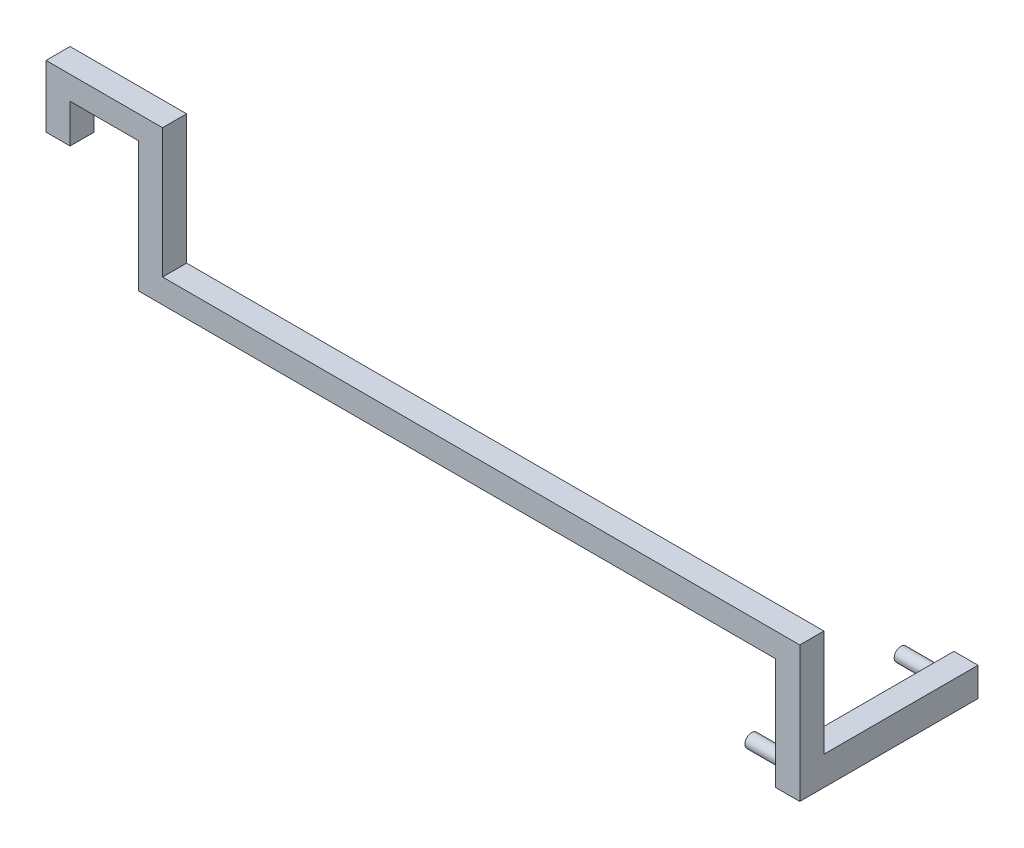
ISO-10303-21;
HEADER;
FILE_DESCRIPTION(('STEP AP214'),'2;1');
FILE_NAME('part.step','',(''),(''),'','','');
FILE_SCHEMA(('AUTOMOTIVE_DESIGN { 1 0 10303 214 1 1 1 1 }'));
ENDSEC;
DATA;
#1=APPLICATION_CONTEXT('core data for automotive mechanical design processes');
#2=APPLICATION_PROTOCOL_DEFINITION('international standard','automotive_design',2000,#1);
#3=PRODUCT_CONTEXT('',#1,'mechanical');
#4=PRODUCT('Part','Part','',(#3));
#5=PRODUCT_RELATED_PRODUCT_CATEGORY('part','',(#4));
#6=PRODUCT_DEFINITION_FORMATION('','',#4);
#7=PRODUCT_DEFINITION_CONTEXT('part definition',#1,'design');
#8=PRODUCT_DEFINITION('design','',#6,#7);
#9=PRODUCT_DEFINITION_SHAPE('','',#8);
#10=(LENGTH_UNIT() NAMED_UNIT(*) SI_UNIT(.MILLI.,.METRE.));
#11=(NAMED_UNIT(*) PLANE_ANGLE_UNIT() SI_UNIT($,.RADIAN.));
#12=(NAMED_UNIT(*) SI_UNIT($,.STERADIAN.) SOLID_ANGLE_UNIT());
#13=UNCERTAINTY_MEASURE_WITH_UNIT(LENGTH_MEASURE(1.E-05),#10,'distance_accuracy_value','');
#14=(GEOMETRIC_REPRESENTATION_CONTEXT(3) GLOBAL_UNCERTAINTY_ASSIGNED_CONTEXT((#13)) GLOBAL_UNIT_ASSIGNED_CONTEXT((#10,
#11,#12)) REPRESENTATION_CONTEXT('',''));
#15=CARTESIAN_POINT('',(0.,0.,0.));
#16=DIRECTION('',(0.,0.,1.));
#17=DIRECTION('',(1.,0.,0.));
#18=AXIS2_PLACEMENT_3D('',#15,#16,#17);
#19=CARTESIAN_POINT('',(0.,6.7,5.));
#20=DIRECTION('',(-1.,0.,0.));
#21=DIRECTION('',(0.,0.,1.));
#22=AXIS2_PLACEMENT_3D('',#19,#20,#21);
#23=PLANE('',#22);
#24=DIRECTION('',(0.,1.,0.));
#25=VECTOR('',#24,1.);
#26=CARTESIAN_POINT('',(0.,6.7,0.));
#27=LINE('',#26,#25);
#28=CARTESIAN_POINT('',(0.,0.,0.));
#29=VERTEX_POINT('',#28);
#30=CARTESIAN_POINT('',(0.,8.05,0.));
#31=VERTEX_POINT('',#30);
#32=EDGE_CURVE('E93',#29,#31,#27,.T.);
#33=ORIENTED_EDGE('',*,*,#32,.T.);
#34=DIRECTION('',(0.,0.,-1.));
#35=VECTOR('',#34,1.);
#36=CARTESIAN_POINT('',(0.,8.05,5.));
#37=LINE('',#36,#35);
#38=CARTESIAN_POINT('',(0.,8.05,5.));
#39=VERTEX_POINT('',#38);
#40=EDGE_CURVE('E203',#39,#31,#37,.T.);
#41=ORIENTED_EDGE('',*,*,#40,.F.);
#42=DIRECTION('',(0.,1.,0.));
#43=VECTOR('',#42,1.);
#44=CARTESIAN_POINT('',(0.,6.7,5.));
#45=LINE('',#44,#43);
#46=CARTESIAN_POINT('',(0.,0.,5.));
#47=VERTEX_POINT('',#46);
#48=EDGE_CURVE('E99',#47,#39,#45,.T.);
#49=ORIENTED_EDGE('',*,*,#48,.F.);
#50=DIRECTION('',(0.,0.,-1.));
#51=VECTOR('',#50,1.);
#52=CARTESIAN_POINT('',(0.,0.,5.));
#53=LINE('',#52,#51);
#54=EDGE_CURVE('E152',#47,#29,#53,.T.);
#55=ORIENTED_EDGE('',*,*,#54,.T.);
#56=EDGE_LOOP('',(#33,#41,#49,#55));
#57=FACE_BOUND('',#56,.T.);
#58=ADVANCED_FACE('F32',(#57),#23,.F.);
#59=CARTESIAN_POINT('',(5.5,8.05,5.));
#60=DIRECTION('',(0.,1.,0.));
#61=DIRECTION('',(0.,0.,1.));
#62=AXIS2_PLACEMENT_3D('',#59,#60,#61);
#63=PLANE('',#62);
#64=DIRECTION('',(1.,0.,0.));
#65=VECTOR('',#64,1.);
#66=CARTESIAN_POINT('',(5.5,8.05,0.));
#67=LINE('',#66,#65);
#68=CARTESIAN_POINT('',(14.2,8.05,0.));
#69=VERTEX_POINT('',#68);
#70=EDGE_CURVE('E157',#31,#69,#67,.T.);
#71=ORIENTED_EDGE('',*,*,#70,.T.);
#72=DIRECTION('',(0.,0.,-1.));
#73=VECTOR('',#72,1.);
#74=CARTESIAN_POINT('',(14.2,8.05,5.));
#75=LINE('',#74,#73);
#76=CARTESIAN_POINT('',(14.2,8.05,5.));
#77=VERTEX_POINT('',#76);
#78=EDGE_CURVE('E200',#77,#69,#75,.T.);
#79=ORIENTED_EDGE('',*,*,#78,.F.);
#80=DIRECTION('',(1.,0.,0.));
#81=VECTOR('',#80,1.);
#82=CARTESIAN_POINT('',(0.,8.05,5.));
#83=LINE('',#82,#81);
#84=EDGE_CURVE('E237',#39,#77,#83,.T.);
#85=ORIENTED_EDGE('',*,*,#84,.F.);
#86=ORIENTED_EDGE('',*,*,#40,.T.);
#87=EDGE_LOOP('',(#71,#79,#85,#86));
#88=FACE_BOUND('',#87,.T.);
#89=ADVANCED_FACE('F267',(#88),#63,.F.);
#90=CARTESIAN_POINT('',(14.2,8.05,5.));
#91=DIRECTION('',(1.,0.,0.));
#92=DIRECTION('',(0.,1.,0.));
#93=AXIS2_PLACEMENT_3D('',#90,#91,#92);
#94=PLANE('',#93);
#95=DIRECTION('',(0.,-1.,0.));
#96=VECTOR('',#95,1.);
#97=CARTESIAN_POINT('',(14.2,8.05,0.));
#98=LINE('',#97,#96);
#99=CARTESIAN_POINT('',(14.2,-18.95,0.));
#100=VERTEX_POINT('',#99);
#101=EDGE_CURVE('E160',#69,#100,#98,.T.);
#102=ORIENTED_EDGE('',*,*,#101,.T.);
#103=DIRECTION('',(0.,0.,-1.));
#104=VECTOR('',#103,1.);
#105=CARTESIAN_POINT('',(14.2,-18.95,5.));
#106=LINE('',#105,#104);
#107=CARTESIAN_POINT('',(14.2,-18.95,5.));
#108=VERTEX_POINT('',#107);
#109=EDGE_CURVE('E197',#108,#100,#106,.T.);
#110=ORIENTED_EDGE('',*,*,#109,.F.);
#111=DIRECTION('',(0.,-1.,0.));
#112=VECTOR('',#111,1.);
#113=CARTESIAN_POINT('',(14.2,8.05,5.));
#114=LINE('',#113,#112);
#115=EDGE_CURVE('E239',#77,#108,#114,.T.);
#116=ORIENTED_EDGE('',*,*,#115,.F.);
#117=ORIENTED_EDGE('',*,*,#78,.T.);
#118=EDGE_LOOP('',(#102,#110,#116,#117));
#119=FACE_BOUND('',#118,.T.);
#120=ADVANCED_FACE('F272',(#119),#94,.F.);
#121=CARTESIAN_POINT('',(14.2,-18.95,5.));
#122=DIRECTION('',(0.,1.,0.));
#123=DIRECTION('',(-1.,0.,0.));
#124=AXIS2_PLACEMENT_3D('',#121,#122,#123);
#125=PLANE('',#124);
#126=DIRECTION('',(1.,0.,0.));
#127=VECTOR('',#126,1.);
#128=CARTESIAN_POINT('',(14.2,-18.95,0.));
#129=LINE('',#128,#127);
#130=CARTESIAN_POINT('',(146.5,-18.95,0.));
#131=VERTEX_POINT('',#130);
#132=EDGE_CURVE('E162',#100,#131,#129,.T.);
#133=ORIENTED_EDGE('',*,*,#132,.T.);
#134=DIRECTION('',(0.,0.,-1.));
#135=VECTOR('',#134,1.);
#136=CARTESIAN_POINT('',(146.5,-18.95,5.));
#137=LINE('',#136,#135);
#138=CARTESIAN_POINT('',(146.5,-18.95,5.));
#139=VERTEX_POINT('',#138);
#140=EDGE_CURVE('E194',#139,#131,#137,.T.);
#141=ORIENTED_EDGE('',*,*,#140,.F.);
#142=DIRECTION('',(1.,0.,0.));
#143=VECTOR('',#142,1.);
#144=CARTESIAN_POINT('',(14.2,-18.95,5.));
#145=LINE('',#144,#143);
#146=EDGE_CURVE('E241',#108,#139,#145,.T.);
#147=ORIENTED_EDGE('',*,*,#146,.F.);
#148=ORIENTED_EDGE('',*,*,#109,.T.);
#149=EDGE_LOOP('',(#133,#141,#147,#148));
#150=FACE_BOUND('',#149,.T.);
#151=ADVANCED_FACE('F214',(#150),#125,.F.);
#152=CARTESIAN_POINT('',(146.5,-18.95,5.));
#153=DIRECTION('',(1.,0.,0.));
#154=DIRECTION('',(0.,0.,-1.));
#155=AXIS2_PLACEMENT_3D('',#152,#153,#154);
#156=PLANE('',#155);
#157=CARTESIAN_POINT('',(146.5,-39.1,2.));
#158=DIRECTION('',(1.,0.,0.));
#159=DIRECTION('',(0.,0.,-1.));
#160=AXIS2_PLACEMENT_3D('',#157,#158,#159);
#161=CIRCLE('',#160,1.4);
#162=CARTESIAN_POINT('',(146.5,-39.1,0.6));
#163=VERTEX_POINT('',#162);
#164=EDGE_CURVE('E11',#163,#163,#161,.F.);
#165=ORIENTED_EDGE('',*,*,#164,.F.);
#166=EDGE_LOOP('',(#165));
#167=FACE_BOUND('',#166,.T.);
#168=CARTESIAN_POINT('',(146.5,-39.1,-29.));
#169=DIRECTION('',(1.,0.,0.));
#170=DIRECTION('',(0.,0.,-1.));
#171=AXIS2_PLACEMENT_3D('',#168,#169,#170);
#172=CIRCLE('',#171,1.4);
#173=CARTESIAN_POINT('',(146.5,-39.1,-30.4));
#174=VERTEX_POINT('',#173);
#175=EDGE_CURVE('E39',#174,#174,#172,.F.);
#176=ORIENTED_EDGE('',*,*,#175,.F.);
#177=EDGE_LOOP('',(#176));
#178=FACE_BOUND('',#177,.T.);
#179=DIRECTION('',(0.,-1.,0.));
#180=VECTOR('',#179,1.);
#181=CARTESIAN_POINT('',(146.5,-18.95,0.));
#182=LINE('',#181,#180);
#183=CARTESIAN_POINT('',(146.5,-36.1,0.));
#184=VERTEX_POINT('',#183);
#185=EDGE_CURVE('E164',#131,#184,#182,.T.);
#186=ORIENTED_EDGE('',*,*,#185,.T.);
#187=DIRECTION('',(0.,0.,1.));
#188=VECTOR('',#187,1.);
#189=CARTESIAN_POINT('',(146.5,-36.1,-32.));
#190=LINE('',#189,#188);
#191=CARTESIAN_POINT('',(146.5,-36.1,-32.));
#192=VERTEX_POINT('',#191);
#193=EDGE_CURVE('E158',#192,#184,#190,.T.);
#194=ORIENTED_EDGE('',*,*,#193,.F.);
#195=DIRECTION('',(0.,1.,0.));
#196=VECTOR('',#195,1.);
#197=CARTESIAN_POINT('',(146.5,-42.1,-32.));
#198=LINE('',#197,#196);
#199=CARTESIAN_POINT('',(146.5,-42.1,-32.));
#200=VERTEX_POINT('',#199);
#201=EDGE_CURVE('E295',#200,#192,#198,.T.);
#202=ORIENTED_EDGE('',*,*,#201,.F.);
#203=DIRECTION('',(0.,0.,-1.));
#204=VECTOR('',#203,1.);
#205=CARTESIAN_POINT('',(146.5,-42.1,5.));
#206=LINE('',#205,#204);
#207=CARTESIAN_POINT('',(146.5,-42.1,5.));
#208=VERTEX_POINT('',#207);
#209=EDGE_CURVE('E191',#208,#200,#206,.T.);
#210=ORIENTED_EDGE('',*,*,#209,.F.);
#211=DIRECTION('',(0.,-1.,0.));
#212=VECTOR('',#211,1.);
#213=CARTESIAN_POINT('',(146.5,-18.95,5.));
#214=LINE('',#213,#212);
#215=EDGE_CURVE('E243',#139,#208,#214,.T.);
#216=ORIENTED_EDGE('',*,*,#215,.F.);
#217=ORIENTED_EDGE('',*,*,#140,.T.);
#218=EDGE_LOOP('',(#186,#194,#202,#210,#216,#217));
#219=FACE_BOUND('',#218,.T.);
#220=ADVANCED_FACE('F210',(#167,#178,#219),#156,.F.);
#221=CARTESIAN_POINT('',(146.5,-42.1,5.));
#222=DIRECTION('',(0.,1.,0.));
#223=DIRECTION('',(0.,0.,1.));
#224=AXIS2_PLACEMENT_3D('',#221,#222,#223);
#225=PLANE('',#224);
#226=ORIENTED_EDGE('',*,*,#209,.T.);
#227=DIRECTION('',(-1.,0.,0.));
#228=VECTOR('',#227,1.);
#229=CARTESIAN_POINT('',(151.5,-42.1,-32.));
#230=LINE('',#229,#228);
#231=CARTESIAN_POINT('',(151.5,-42.1,-32.));
#232=VERTEX_POINT('',#231);
#233=EDGE_CURVE('E282',#232,#200,#230,.T.);
#234=ORIENTED_EDGE('',*,*,#233,.F.);
#235=DIRECTION('',(0.,0.,-1.));
#236=VECTOR('',#235,1.);
#237=CARTESIAN_POINT('',(151.5,-42.1,5.));
#238=LINE('',#237,#236);
#239=CARTESIAN_POINT('',(151.5,-42.1,5.));
#240=VERTEX_POINT('',#239);
#241=EDGE_CURVE('E188',#240,#232,#238,.T.);
#242=ORIENTED_EDGE('',*,*,#241,.F.);
#243=DIRECTION('',(1.,0.,0.));
#244=VECTOR('',#243,1.);
#245=CARTESIAN_POINT('',(146.5,-42.1,5.));
#246=LINE('',#245,#244);
#247=EDGE_CURVE('E245',#208,#240,#246,.T.);
#248=ORIENTED_EDGE('',*,*,#247,.F.);
#249=EDGE_LOOP('',(#226,#234,#242,#248));
#250=FACE_BOUND('',#249,.T.);
#251=ADVANCED_FACE('F213',(#250),#225,.F.);
#252=CARTESIAN_POINT('',(151.5,-13.95,5.));
#253=DIRECTION('',(-1.,0.,0.));
#254=DIRECTION('',(0.,0.,1.));
#255=AXIS2_PLACEMENT_3D('',#252,#253,#254);
#256=PLANE('',#255);
#257=ORIENTED_EDGE('',*,*,#241,.T.);
#258=DIRECTION('',(0.,-1.,0.));
#259=VECTOR('',#258,1.);
#260=CARTESIAN_POINT('',(151.5,-42.1,-32.));
#261=LINE('',#260,#259);
#262=CARTESIAN_POINT('',(151.5,-36.1,-32.));
#263=VERTEX_POINT('',#262);
#264=EDGE_CURVE('E294',#263,#232,#261,.T.);
#265=ORIENTED_EDGE('',*,*,#264,.F.);
#266=DIRECTION('',(0.,0.,1.));
#267=VECTOR('',#266,1.);
#268=CARTESIAN_POINT('',(151.5,-36.1,-32.));
#269=LINE('',#268,#267);
#270=CARTESIAN_POINT('',(151.5,-36.1,0.));
#271=VERTEX_POINT('',#270);
#272=EDGE_CURVE('E231',#263,#271,#269,.T.);
#273=ORIENTED_EDGE('',*,*,#272,.T.);
#274=DIRECTION('',(0.,1.,0.));
#275=VECTOR('',#274,1.);
#276=CARTESIAN_POINT('',(151.5,-13.95,0.));
#277=LINE('',#276,#275);
#278=CARTESIAN_POINT('',(151.5,-13.95,0.));
#279=VERTEX_POINT('',#278);
#280=EDGE_CURVE('E166',#271,#279,#277,.T.);
#281=ORIENTED_EDGE('',*,*,#280,.T.);
#282=DIRECTION('',(0.,0.,-1.));
#283=VECTOR('',#282,1.);
#284=CARTESIAN_POINT('',(151.5,-13.95,5.));
#285=LINE('',#284,#283);
#286=CARTESIAN_POINT('',(151.5,-13.95,5.));
#287=VERTEX_POINT('',#286);
#288=EDGE_CURVE('E185',#287,#279,#285,.T.);
#289=ORIENTED_EDGE('',*,*,#288,.F.);
#290=DIRECTION('',(0.,1.,0.));
#291=VECTOR('',#290,1.);
#292=CARTESIAN_POINT('',(151.5,-13.95,5.));
#293=LINE('',#292,#291);
#294=EDGE_CURVE('E247',#240,#287,#293,.T.);
#295=ORIENTED_EDGE('',*,*,#294,.F.);
#296=EDGE_LOOP('',(#257,#265,#273,#281,#289,#295));
#297=FACE_BOUND('',#296,.T.);
#298=ADVANCED_FACE('F286',(#297),#256,.F.);
#299=CARTESIAN_POINT('',(19.2,-13.95,5.));
#300=DIRECTION('',(0.,-1.,0.));
#301=DIRECTION('',(0.,0.,-1.));
#302=AXIS2_PLACEMENT_3D('',#299,#300,#301);
#303=PLANE('',#302);
#304=DIRECTION('',(-1.,0.,0.));
#305=VECTOR('',#304,1.);
#306=CARTESIAN_POINT('',(19.2,-13.95,0.));
#307=LINE('',#306,#305);
#308=CARTESIAN_POINT('',(19.2,-13.95,0.));
#309=VERTEX_POINT('',#308);
#310=EDGE_CURVE('E168',#279,#309,#307,.T.);
#311=ORIENTED_EDGE('',*,*,#310,.T.);
#312=DIRECTION('',(0.,0.,-1.));
#313=VECTOR('',#312,1.);
#314=CARTESIAN_POINT('',(19.2,-13.95,5.));
#315=LINE('',#314,#313);
#316=CARTESIAN_POINT('',(19.2,-13.95,5.));
#317=VERTEX_POINT('',#316);
#318=EDGE_CURVE('E182',#317,#309,#315,.T.);
#319=ORIENTED_EDGE('',*,*,#318,.F.);
#320=DIRECTION('',(-1.,0.,0.));
#321=VECTOR('',#320,1.);
#322=CARTESIAN_POINT('',(19.2,-13.95,5.));
#323=LINE('',#322,#321);
#324=EDGE_CURVE('E249',#287,#317,#323,.T.);
#325=ORIENTED_EDGE('',*,*,#324,.F.);
#326=ORIENTED_EDGE('',*,*,#288,.T.);
#327=EDGE_LOOP('',(#311,#319,#325,#326));
#328=FACE_BOUND('',#327,.T.);
#329=ADVANCED_FACE('F255',(#328),#303,.F.);
#330=CARTESIAN_POINT('',(19.2,12.9,5.));
#331=DIRECTION('',(-1.,0.,0.));
#332=DIRECTION('',(0.,-1.,0.));
#333=AXIS2_PLACEMENT_3D('',#330,#331,#332);
#334=PLANE('',#333);
#335=DIRECTION('',(0.,1.,0.));
#336=VECTOR('',#335,1.);
#337=CARTESIAN_POINT('',(19.2,12.9,0.));
#338=LINE('',#337,#336);
#339=CARTESIAN_POINT('',(19.2,12.9,0.));
#340=VERTEX_POINT('',#339);
#341=EDGE_CURVE('E170',#309,#340,#338,.T.);
#342=ORIENTED_EDGE('',*,*,#341,.T.);
#343=DIRECTION('',(0.,0.,-1.));
#344=VECTOR('',#343,1.);
#345=CARTESIAN_POINT('',(19.2,12.9,5.));
#346=LINE('',#345,#344);
#347=CARTESIAN_POINT('',(19.2,12.9,5.));
#348=VERTEX_POINT('',#347);
#349=EDGE_CURVE('E146',#348,#340,#346,.T.);
#350=ORIENTED_EDGE('',*,*,#349,.F.);
#351=DIRECTION('',(0.,1.,0.));
#352=VECTOR('',#351,1.);
#353=CARTESIAN_POINT('',(19.2,12.9,5.));
#354=LINE('',#353,#352);
#355=EDGE_CURVE('E135',#317,#348,#354,.T.);
#356=ORIENTED_EDGE('',*,*,#355,.F.);
#357=ORIENTED_EDGE('',*,*,#318,.T.);
#358=EDGE_LOOP('',(#342,#350,#356,#357));
#359=FACE_BOUND('',#358,.T.);
#360=ADVANCED_FACE('F259',(#359),#334,.F.);
#361=CARTESIAN_POINT('',(-5.,12.9,5.));
#362=DIRECTION('',(0.,-1.,0.));
#363=DIRECTION('',(0.,0.,-1.));
#364=AXIS2_PLACEMENT_3D('',#361,#362,#363);
#365=PLANE('',#364);
#366=DIRECTION('',(-1.,0.,0.));
#367=VECTOR('',#366,1.);
#368=CARTESIAN_POINT('',(-5.,12.9,0.));
#369=LINE('',#368,#367);
#370=CARTESIAN_POINT('',(-5.,12.9,0.));
#371=VERTEX_POINT('',#370);
#372=EDGE_CURVE('E143',#340,#371,#369,.T.);
#373=ORIENTED_EDGE('',*,*,#372,.T.);
#374=DIRECTION('',(0.,0.,-1.));
#375=VECTOR('',#374,1.);
#376=CARTESIAN_POINT('',(-5.,12.9,5.));
#377=LINE('',#376,#375);
#378=CARTESIAN_POINT('',(-5.,12.9,5.));
#379=VERTEX_POINT('',#378);
#380=EDGE_CURVE('E141',#379,#371,#377,.T.);
#381=ORIENTED_EDGE('',*,*,#380,.F.);
#382=DIRECTION('',(-1.,0.,0.));
#383=VECTOR('',#382,1.);
#384=CARTESIAN_POINT('',(5.5,12.9,5.));
#385=LINE('',#384,#383);
#386=EDGE_CURVE('E128',#348,#379,#385,.T.);
#387=ORIENTED_EDGE('',*,*,#386,.F.);
#388=ORIENTED_EDGE('',*,*,#349,.T.);
#389=EDGE_LOOP('',(#373,#381,#387,#388));
#390=FACE_BOUND('',#389,.T.);
#391=ADVANCED_FACE('F142',(#390),#365,.F.);
#392=CARTESIAN_POINT('',(-5.,0.,5.));
#393=DIRECTION('',(1.,0.,0.));
#394=DIRECTION('',(0.,0.,-1.));
#395=AXIS2_PLACEMENT_3D('',#392,#393,#394);
#396=PLANE('',#395);
#397=DIRECTION('',(0.,-1.,0.));
#398=VECTOR('',#397,1.);
#399=CARTESIAN_POINT('',(-5.,0.,0.));
#400=LINE('',#399,#398);
#401=CARTESIAN_POINT('',(-5.,0.,0.));
#402=VERTEX_POINT('',#401);
#403=EDGE_CURVE('E174',#371,#402,#400,.T.);
#404=ORIENTED_EDGE('',*,*,#403,.T.);
#405=DIRECTION('',(0.,0.,-1.));
#406=VECTOR('',#405,1.);
#407=CARTESIAN_POINT('',(-5.,0.,5.));
#408=LINE('',#407,#406);
#409=CARTESIAN_POINT('',(-5.,0.,5.));
#410=VERTEX_POINT('',#409);
#411=EDGE_CURVE('E147',#410,#402,#408,.T.);
#412=ORIENTED_EDGE('',*,*,#411,.F.);
#413=DIRECTION('',(0.,-1.,0.));
#414=VECTOR('',#413,1.);
#415=CARTESIAN_POINT('',(-5.,0.,5.));
#416=LINE('',#415,#414);
#417=EDGE_CURVE('E132',#379,#410,#416,.T.);
#418=ORIENTED_EDGE('',*,*,#417,.F.);
#419=ORIENTED_EDGE('',*,*,#380,.T.);
#420=EDGE_LOOP('',(#404,#412,#418,#419));
#421=FACE_BOUND('',#420,.T.);
#422=ADVANCED_FACE('F149',(#421),#396,.F.);
#423=CARTESIAN_POINT('',(0.,0.,5.));
#424=DIRECTION('',(0.,1.,0.));
#425=DIRECTION('',(-1.,0.,0.));
#426=AXIS2_PLACEMENT_3D('',#423,#424,#425);
#427=PLANE('',#426);
#428=DIRECTION('',(1.,0.,0.));
#429=VECTOR('',#428,1.);
#430=CARTESIAN_POINT('',(0.,0.,0.));
#431=LINE('',#430,#429);
#432=EDGE_CURVE('E176',#402,#29,#431,.T.);
#433=ORIENTED_EDGE('',*,*,#432,.T.);
#434=ORIENTED_EDGE('',*,*,#54,.F.);
#435=DIRECTION('',(1.,0.,0.));
#436=VECTOR('',#435,1.);
#437=CARTESIAN_POINT('',(0.,0.,5.));
#438=LINE('',#437,#436);
#439=EDGE_CURVE('E55',#410,#47,#438,.T.);
#440=ORIENTED_EDGE('',*,*,#439,.F.);
#441=ORIENTED_EDGE('',*,*,#411,.T.);
#442=EDGE_LOOP('',(#433,#434,#440,#441));
#443=FACE_BOUND('',#442,.T.);
#444=ADVANCED_FACE('F262',(#443),#427,.F.);
#445=CARTESIAN_POINT('',(0.,0.,5.));
#446=DIRECTION('',(0.,0.,-1.));
#447=DIRECTION('',(-1.,0.,0.));
#448=AXIS2_PLACEMENT_3D('',#445,#446,#447);
#449=PLANE('',#448);
#450=ORIENTED_EDGE('',*,*,#48,.T.);
#451=ORIENTED_EDGE('',*,*,#84,.T.);
#452=ORIENTED_EDGE('',*,*,#115,.T.);
#453=ORIENTED_EDGE('',*,*,#146,.T.);
#454=ORIENTED_EDGE('',*,*,#215,.T.);
#455=ORIENTED_EDGE('',*,*,#247,.T.);
#456=ORIENTED_EDGE('',*,*,#294,.T.);
#457=ORIENTED_EDGE('',*,*,#324,.T.);
#458=ORIENTED_EDGE('',*,*,#355,.T.);
#459=ORIENTED_EDGE('',*,*,#386,.T.);
#460=ORIENTED_EDGE('',*,*,#417,.T.);
#461=ORIENTED_EDGE('',*,*,#439,.T.);
#462=EDGE_LOOP('',(#450,#451,#452,#453,#454,#455,#456,#457,#458,#459,#460,#461));
#463=FACE_BOUND('',#462,.T.);
#464=ADVANCED_FACE('F130',(#463),#449,.F.);
#465=CARTESIAN_POINT('',(0.,0.,0.));
#466=DIRECTION('',(0.,0.,-1.));
#467=DIRECTION('',(-1.,0.,0.));
#468=AXIS2_PLACEMENT_3D('',#465,#466,#467);
#469=PLANE('',#468);
#470=DIRECTION('',(1.,0.,0.));
#471=VECTOR('',#470,1.);
#472=CARTESIAN_POINT('',(151.5,-36.1,0.));
#473=LINE('',#472,#471);
#474=EDGE_CURVE('E46',#184,#271,#473,.T.);
#475=ORIENTED_EDGE('',*,*,#474,.F.);
#476=ORIENTED_EDGE('',*,*,#185,.F.);
#477=ORIENTED_EDGE('',*,*,#132,.F.);
#478=ORIENTED_EDGE('',*,*,#101,.F.);
#479=ORIENTED_EDGE('',*,*,#70,.F.);
#480=ORIENTED_EDGE('',*,*,#32,.F.);
#481=ORIENTED_EDGE('',*,*,#432,.F.);
#482=ORIENTED_EDGE('',*,*,#403,.F.);
#483=ORIENTED_EDGE('',*,*,#372,.F.);
#484=ORIENTED_EDGE('',*,*,#341,.F.);
#485=ORIENTED_EDGE('',*,*,#310,.F.);
#486=ORIENTED_EDGE('',*,*,#280,.F.);
#487=EDGE_LOOP('',(#475,#476,#477,#478,#479,#480,#481,#482,#483,#484,#485,#486));
#488=FACE_BOUND('',#487,.T.);
#489=ADVANCED_FACE('F260',(#488),#469,.T.);
#490=CARTESIAN_POINT('',(151.5,-36.1,-32.));
#491=DIRECTION('',(0.,-1.,0.));
#492=DIRECTION('',(0.,0.,-1.));
#493=AXIS2_PLACEMENT_3D('',#490,#491,#492);
#494=PLANE('',#493);
#495=ORIENTED_EDGE('',*,*,#474,.T.);
#496=ORIENTED_EDGE('',*,*,#272,.F.);
#497=DIRECTION('',(1.,0.,0.));
#498=VECTOR('',#497,1.);
#499=CARTESIAN_POINT('',(151.5,-36.1,-32.));
#500=LINE('',#499,#498);
#501=EDGE_CURVE('E230',#192,#263,#500,.T.);
#502=ORIENTED_EDGE('',*,*,#501,.F.);
#503=ORIENTED_EDGE('',*,*,#193,.T.);
#504=EDGE_LOOP('',(#495,#496,#502,#503));
#505=FACE_BOUND('',#504,.T.);
#506=ADVANCED_FACE('F226',(#505),#494,.F.);
#507=CARTESIAN_POINT('',(0.,0.,-32.));
#508=DIRECTION('',(0.,0.,1.));
#509=DIRECTION('',(1.,0.,0.));
#510=AXIS2_PLACEMENT_3D('',#507,#508,#509);
#511=PLANE('',#510);
#512=ORIENTED_EDGE('',*,*,#264,.T.);
#513=ORIENTED_EDGE('',*,*,#233,.T.);
#514=ORIENTED_EDGE('',*,*,#201,.T.);
#515=ORIENTED_EDGE('',*,*,#501,.T.);
#516=EDGE_LOOP('',(#512,#513,#514,#515));
#517=FACE_BOUND('',#516,.T.);
#518=ADVANCED_FACE('F293',(#517),#511,.F.);
#519=CARTESIAN_POINT('',(138.5,-39.1,-29.));
#520=DIRECTION('',(1.,0.,0.));
#521=DIRECTION('',(0.,0.,-1.));
#522=AXIS2_PLACEMENT_3D('',#519,#520,#521);
#523=CYLINDRICAL_SURFACE('',#522,1.4);
#524=CARTESIAN_POINT('',(138.5,-39.1,-29.));
#525=DIRECTION('',(-1.,0.,0.));
#526=DIRECTION('',(0.,0.,1.));
#527=AXIS2_PLACEMENT_3D('',#524,#525,#526);
#528=CIRCLE('',#527,1.4);
#529=CARTESIAN_POINT('',(138.5,-39.1,-27.6));
#530=VERTEX_POINT('',#529);
#531=EDGE_CURVE('E299',#530,#530,#528,.T.);
#532=ORIENTED_EDGE('',*,*,#531,.F.);
#533=EDGE_LOOP('',(#532));
#534=FACE_BOUND('',#533,.T.);
#535=ORIENTED_EDGE('',*,*,#175,.T.);
#536=EDGE_LOOP('',(#535));
#537=FACE_BOUND('',#536,.T.);
#538=ADVANCED_FACE('F208',(#534,#537),#523,.T.);
#539=CARTESIAN_POINT('',(138.5,-39.1,-29.));
#540=DIRECTION('',(-1.,0.,0.));
#541=DIRECTION('',(0.,0.,1.));
#542=AXIS2_PLACEMENT_3D('',#539,#540,#541);
#543=PLANE('',#542);
#544=ORIENTED_EDGE('',*,*,#531,.T.);
#545=EDGE_LOOP('',(#544));
#546=FACE_BOUND('',#545,.T.);
#547=ADVANCED_FACE('F313',(#546),#543,.T.);
#548=CARTESIAN_POINT('',(138.5,-39.1,2.));
#549=DIRECTION('',(1.,0.,0.));
#550=DIRECTION('',(0.,0.,-1.));
#551=AXIS2_PLACEMENT_3D('',#548,#549,#550);
#552=CYLINDRICAL_SURFACE('',#551,1.4);
#553=CARTESIAN_POINT('',(138.5,-39.1,2.));
#554=DIRECTION('',(-1.,0.,0.));
#555=DIRECTION('',(0.,0.,1.));
#556=AXIS2_PLACEMENT_3D('',#553,#554,#555);
#557=CIRCLE('',#556,1.4);
#558=CARTESIAN_POINT('',(138.5,-39.1,3.4));
#559=VERTEX_POINT('',#558);
#560=EDGE_CURVE('E304',#559,#559,#557,.T.);
#561=ORIENTED_EDGE('',*,*,#560,.F.);
#562=EDGE_LOOP('',(#561));
#563=FACE_BOUND('',#562,.T.);
#564=ORIENTED_EDGE('',*,*,#164,.T.);
#565=EDGE_LOOP('',(#564));
#566=FACE_BOUND('',#565,.T.);
#567=ADVANCED_FACE('F310',(#563,#566),#552,.T.);
#568=CARTESIAN_POINT('',(138.5,-39.1,2.));
#569=DIRECTION('',(-1.,0.,0.));
#570=DIRECTION('',(0.,0.,1.));
#571=AXIS2_PLACEMENT_3D('',#568,#569,#570);
#572=PLANE('',#571);
#573=ORIENTED_EDGE('',*,*,#560,.T.);
#574=EDGE_LOOP('',(#573));
#575=FACE_BOUND('',#574,.T.);
#576=ADVANCED_FACE('F308',(#575),#572,.T.);
#577=CLOSED_SHELL('',(#58,#89,#120,#151,#220,#251,#298,#329,#360,#391,#422,#444,#464,#489,#506,
#518,#538,#547,#567,#576));
#578=MANIFOLD_SOLID_BREP('B2',#577);
#579=ADVANCED_BREP_SHAPE_REPRESENTATION('',(#18,#578),#14);
#580=SHAPE_DEFINITION_REPRESENTATION(#9,#579);
ENDSEC;
END-ISO-10303-21;
